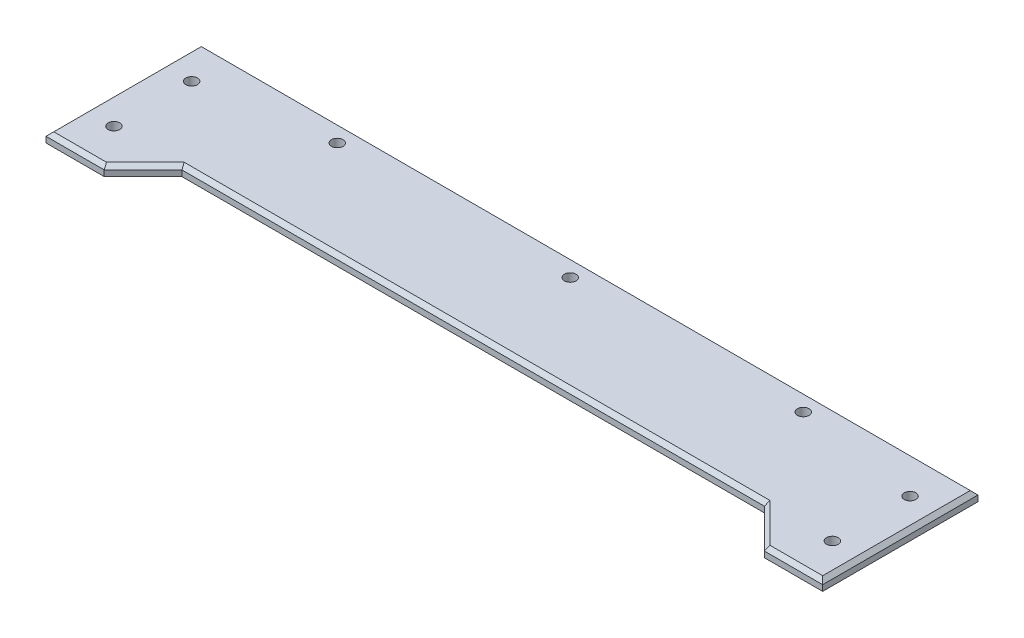
ISO-10303-21;
HEADER;
FILE_DESCRIPTION(('STEP AP214'),'2;1');
FILE_NAME('part.step','',(''),(''),'','','');
FILE_SCHEMA(('AUTOMOTIVE_DESIGN { 1 0 10303 214 1 1 1 1 }'));
ENDSEC;
DATA;
#1=APPLICATION_CONTEXT('core data for automotive mechanical design processes');
#2=APPLICATION_PROTOCOL_DEFINITION('international standard','automotive_design',2000,#1);
#3=PRODUCT_CONTEXT('',#1,'mechanical');
#4=PRODUCT('Part','Part','',(#3));
#5=PRODUCT_RELATED_PRODUCT_CATEGORY('part','',(#4));
#6=PRODUCT_DEFINITION_FORMATION('','',#4);
#7=PRODUCT_DEFINITION_CONTEXT('part definition',#1,'design');
#8=PRODUCT_DEFINITION('design','',#6,#7);
#9=PRODUCT_DEFINITION_SHAPE('','',#8);
#10=(LENGTH_UNIT() NAMED_UNIT(*) SI_UNIT(.MILLI.,.METRE.));
#11=(NAMED_UNIT(*) PLANE_ANGLE_UNIT() SI_UNIT($,.RADIAN.));
#12=(NAMED_UNIT(*) SI_UNIT($,.STERADIAN.) SOLID_ANGLE_UNIT());
#13=UNCERTAINTY_MEASURE_WITH_UNIT(LENGTH_MEASURE(1.E-05),#10,'distance_accuracy_value','');
#14=(GEOMETRIC_REPRESENTATION_CONTEXT(3) GLOBAL_UNCERTAINTY_ASSIGNED_CONTEXT((#13)) GLOBAL_UNIT_ASSIGNED_CONTEXT((#10,
#11,#12)) REPRESENTATION_CONTEXT('',''));
#15=CARTESIAN_POINT('',(0.,0.,0.));
#16=DIRECTION('',(0.,0.,1.));
#17=DIRECTION('',(1.,0.,0.));
#18=AXIS2_PLACEMENT_3D('',#15,#16,#17);
#19=CARTESIAN_POINT('',(0.,5.,0.));
#20=DIRECTION('',(0.,1.,0.));
#21=DIRECTION('',(0.,0.,1.));
#22=AXIS2_PLACEMENT_3D('',#19,#20,#21);
#23=PLANE('',#22);
#24=DIRECTION('',(1.,0.,0.));
#25=VECTOR('',#24,1.);
#26=CARTESIAN_POINT('',(170.392156862745,5.,17.6078431372549));
#27=LINE('',#26,#25);
#28=CARTESIAN_POINT('',(-130.436270262001,5.,17.6078431372549));
#29=VERTEX_POINT('',#28);
#30=CARTESIAN_POINT('',(171.220583987491,5.,17.6078431372549));
#31=VERTEX_POINT('',#30);
#32=EDGE_CURVE('E185',#29,#31,#27,.T.);
#33=ORIENTED_EDGE('',*,*,#32,.T.);
#34=DIRECTION('',(0.707106781186546,0.,0.707106781186549));
#35=VECTOR('',#34,1.);
#36=CARTESIAN_POINT('',(191.806370425118,5.,38.1936295748818));
#37=LINE('',#36,#35);
#38=CARTESIAN_POINT('',(191.220583987491,5.,37.6078431372549));
#39=VERTEX_POINT('',#38);
#40=EDGE_CURVE('E189',#31,#39,#37,.T.);
#41=ORIENTED_EDGE('',*,*,#40,.T.);
#42=DIRECTION('',(1.,0.,0.));
#43=VECTOR('',#42,1.);
#44=CARTESIAN_POINT('',(220.392156862745,5.,37.6078431372549));
#45=LINE('',#44,#43);
#46=CARTESIAN_POINT('',(218.392156862745,5.,37.6078431372549));
#47=VERTEX_POINT('',#46);
#48=EDGE_CURVE('E187',#39,#47,#45,.T.);
#49=ORIENTED_EDGE('',*,*,#48,.T.);
#50=DIRECTION('',(0.,0.,-1.));
#51=VECTOR('',#50,1.);
#52=CARTESIAN_POINT('',(218.392156862745,5.,-40.3921568627451));
#53=LINE('',#52,#51);
#54=CARTESIAN_POINT('',(218.392156862745,5.,-38.3921568627451));
#55=VERTEX_POINT('',#54);
#56=EDGE_CURVE('E181',#47,#55,#53,.T.);
#57=ORIENTED_EDGE('',*,*,#56,.T.);
#58=DIRECTION('',(-1.,0.,0.));
#59=VECTOR('',#58,1.);
#60=CARTESIAN_POINT('',(-179.607843137255,5.,-38.3921568627451));
#61=LINE('',#60,#59);
#62=CARTESIAN_POINT('',(-177.607843137255,5.,-38.3921568627451));
#63=VERTEX_POINT('',#62);
#64=EDGE_CURVE('E179',#55,#63,#61,.T.);
#65=ORIENTED_EDGE('',*,*,#64,.T.);
#66=DIRECTION('',(0.,0.,1.));
#67=VECTOR('',#66,1.);
#68=CARTESIAN_POINT('',(-177.607843137255,5.,39.6078431372549));
#69=LINE('',#68,#67);
#70=CARTESIAN_POINT('',(-177.607843137255,5.,37.6078431372549));
#71=VERTEX_POINT('',#70);
#72=EDGE_CURVE('E177',#63,#71,#69,.T.);
#73=ORIENTED_EDGE('',*,*,#72,.T.);
#74=DIRECTION('',(1.,0.,0.));
#75=VECTOR('',#74,1.);
#76=CARTESIAN_POINT('',(-149.607843137255,5.,37.6078431372549));
#77=LINE('',#76,#75);
#78=CARTESIAN_POINT('',(-150.436270262001,5.,37.6078431372549));
#79=VERTEX_POINT('',#78);
#80=EDGE_CURVE('E126',#71,#79,#77,.T.);
#81=ORIENTED_EDGE('',*,*,#80,.T.);
#82=DIRECTION('',(0.707106781186546,0.,-0.707106781186549));
#83=VECTOR('',#82,1.);
#84=CARTESIAN_POINT('',(-131.022056699628,5.,18.1936295748818));
#85=LINE('',#84,#83);
#86=EDGE_CURVE('E183',#79,#29,#85,.T.);
#87=ORIENTED_EDGE('',*,*,#86,.T.);
#88=EDGE_LOOP('',(#33,#41,#49,#57,#65,#73,#81,#87));
#89=FACE_BOUND('',#88,.T.);
#90=CARTESIAN_POINT('',(205.392156862745,5.,-20.3921568627451));
#91=DIRECTION('',(0.,1.,0.));
#92=DIRECTION('',(0.,0.,1.));
#93=AXIS2_PLACEMENT_3D('',#90,#91,#92);
#94=CIRCLE('',#93,2.99999999999999);
#95=CARTESIAN_POINT('',(205.392156862745,5.,-17.3921568627451));
#96=VERTEX_POINT('',#95);
#97=EDGE_CURVE('E241',#96,#96,#94,.T.);
#98=ORIENTED_EDGE('',*,*,#97,.F.);
#99=EDGE_LOOP('',(#98));
#100=FACE_BOUND('',#99,.T.);
#101=CARTESIAN_POINT('',(20.392156862745,5.,-30.3921568627451));
#102=DIRECTION('',(0.,1.,0.));
#103=DIRECTION('',(0.,0.,1.));
#104=AXIS2_PLACEMENT_3D('',#101,#102,#103);
#105=CIRCLE('',#104,3.);
#106=CARTESIAN_POINT('',(20.392156862745,5.,-27.3921568627451));
#107=VERTEX_POINT('',#106);
#108=EDGE_CURVE('E253',#107,#107,#105,.T.);
#109=ORIENTED_EDGE('',*,*,#108,.F.);
#110=EDGE_LOOP('',(#109));
#111=FACE_BOUND('',#110,.T.);
#112=CARTESIAN_POINT('',(-99.607843137255,5.,-30.3921568627451));
#113=DIRECTION('',(0.,1.,0.));
#114=DIRECTION('',(0.,0.,1.));
#115=AXIS2_PLACEMENT_3D('',#112,#113,#114);
#116=CIRCLE('',#115,3.00000000000001);
#117=CARTESIAN_POINT('',(-99.607843137255,5.,-27.3921568627451));
#118=VERTEX_POINT('',#117);
#119=EDGE_CURVE('E265',#118,#118,#116,.T.);
#120=ORIENTED_EDGE('',*,*,#119,.F.);
#121=EDGE_LOOP('',(#120));
#122=FACE_BOUND('',#121,.T.);
#123=CARTESIAN_POINT('',(-164.607843137255,5.,-20.3921568627451));
#124=DIRECTION('',(0.,1.,0.));
#125=DIRECTION('',(0.,0.,1.));
#126=AXIS2_PLACEMENT_3D('',#123,#124,#125);
#127=CIRCLE('',#126,2.99999999999999);
#128=CARTESIAN_POINT('',(-164.607843137255,5.,-17.3921568627451));
#129=VERTEX_POINT('',#128);
#130=EDGE_CURVE('E142',#129,#129,#127,.T.);
#131=ORIENTED_EDGE('',*,*,#130,.F.);
#132=EDGE_LOOP('',(#131));
#133=FACE_BOUND('',#132,.T.);
#134=CARTESIAN_POINT('',(140.392156862745,5.,-30.3921568627451));
#135=DIRECTION('',(0.,1.,0.));
#136=DIRECTION('',(0.,0.,1.));
#137=AXIS2_PLACEMENT_3D('',#134,#135,#136);
#138=CIRCLE('',#137,2.99999999999999);
#139=CARTESIAN_POINT('',(140.392156862745,5.,-27.3921568627451));
#140=VERTEX_POINT('',#139);
#141=EDGE_CURVE('E259',#140,#140,#138,.T.);
#142=ORIENTED_EDGE('',*,*,#141,.F.);
#143=EDGE_LOOP('',(#142));
#144=FACE_BOUND('',#143,.T.);
#145=CARTESIAN_POINT('',(-164.607843137255,5.,19.6078431372549));
#146=DIRECTION('',(0.,1.,0.));
#147=DIRECTION('',(0.,0.,1.));
#148=AXIS2_PLACEMENT_3D('',#145,#146,#147);
#149=CIRCLE('',#148,2.99999999999999);
#150=CARTESIAN_POINT('',(-164.607843137255,5.,22.6078431372549));
#151=VERTEX_POINT('',#150);
#152=EDGE_CURVE('E247',#151,#151,#149,.T.);
#153=ORIENTED_EDGE('',*,*,#152,.F.);
#154=EDGE_LOOP('',(#153));
#155=FACE_BOUND('',#154,.T.);
#156=CARTESIAN_POINT('',(205.392156862745,5.,19.6078431372549));
#157=DIRECTION('',(0.,1.,0.));
#158=DIRECTION('',(0.,0.,1.));
#159=AXIS2_PLACEMENT_3D('',#156,#157,#158);
#160=CIRCLE('',#159,2.99999999999999);
#161=CARTESIAN_POINT('',(205.392156862745,5.,22.6078431372549));
#162=VERTEX_POINT('',#161);
#163=EDGE_CURVE('E233',#162,#162,#160,.T.);
#164=ORIENTED_EDGE('',*,*,#163,.F.);
#165=EDGE_LOOP('',(#164));
#166=FACE_BOUND('',#165,.T.);
#167=ADVANCED_FACE('F33',(#89,#100,#111,#122,#133,#144,#155,#166),#23,.T.);
#168=CARTESIAN_POINT('',(0.,0.,0.));
#169=DIRECTION('',(0.,1.,0.));
#170=DIRECTION('',(0.,0.,1.));
#171=AXIS2_PLACEMENT_3D('',#168,#169,#170);
#172=PLANE('',#171);
#173=CARTESIAN_POINT('',(205.392156862745,0.,-20.3921568627451));
#174=DIRECTION('',(0.,1.,0.));
#175=DIRECTION('',(0.,0.,1.));
#176=AXIS2_PLACEMENT_3D('',#173,#174,#175);
#177=CIRCLE('',#176,2.99999999999999);
#178=CARTESIAN_POINT('',(205.392156862745,0.,-17.3921568627451));
#179=VERTEX_POINT('',#178);
#180=EDGE_CURVE('E238',#179,#179,#177,.T.);
#181=ORIENTED_EDGE('',*,*,#180,.T.);
#182=EDGE_LOOP('',(#181));
#183=FACE_BOUND('',#182,.T.);
#184=CARTESIAN_POINT('',(20.392156862745,0.,-30.3921568627451));
#185=DIRECTION('',(0.,1.,0.));
#186=DIRECTION('',(0.,0.,1.));
#187=AXIS2_PLACEMENT_3D('',#184,#185,#186);
#188=CIRCLE('',#187,3.);
#189=CARTESIAN_POINT('',(20.392156862745,0.,-27.3921568627451));
#190=VERTEX_POINT('',#189);
#191=EDGE_CURVE('E250',#190,#190,#188,.T.);
#192=ORIENTED_EDGE('',*,*,#191,.T.);
#193=EDGE_LOOP('',(#192));
#194=FACE_BOUND('',#193,.T.);
#195=CARTESIAN_POINT('',(-99.607843137255,0.,-30.3921568627451));
#196=DIRECTION('',(0.,1.,0.));
#197=DIRECTION('',(0.,0.,1.));
#198=AXIS2_PLACEMENT_3D('',#195,#196,#197);
#199=CIRCLE('',#198,3.00000000000001);
#200=CARTESIAN_POINT('',(-99.607843137255,0.,-27.3921568627451));
#201=VERTEX_POINT('',#200);
#202=EDGE_CURVE('E262',#201,#201,#199,.T.);
#203=ORIENTED_EDGE('',*,*,#202,.T.);
#204=EDGE_LOOP('',(#203));
#205=FACE_BOUND('',#204,.T.);
#206=DIRECTION('',(0.,0.,1.));
#207=VECTOR('',#206,1.);
#208=CARTESIAN_POINT('',(-179.607843137255,0.,-40.3921568627451));
#209=LINE('',#208,#207);
#210=CARTESIAN_POINT('',(-179.607843137255,0.,-40.3921568627451));
#211=VERTEX_POINT('',#210);
#212=CARTESIAN_POINT('',(-179.607843137255,0.,39.6078431372549));
#213=VERTEX_POINT('',#212);
#214=EDGE_CURVE('E134',#211,#213,#209,.T.);
#215=ORIENTED_EDGE('',*,*,#214,.F.);
#216=DIRECTION('',(-1.,0.,0.));
#217=VECTOR('',#216,1.);
#218=CARTESIAN_POINT('',(-179.607843137255,0.,-40.3921568627451));
#219=LINE('',#218,#217);
#220=CARTESIAN_POINT('',(220.392156862745,0.,-40.3921568627451));
#221=VERTEX_POINT('',#220);
#222=EDGE_CURVE('E162',#221,#211,#219,.T.);
#223=ORIENTED_EDGE('',*,*,#222,.F.);
#224=DIRECTION('',(0.,0.,-1.));
#225=VECTOR('',#224,1.);
#226=CARTESIAN_POINT('',(220.392156862745,0.,-40.3921568627451));
#227=LINE('',#226,#225);
#228=CARTESIAN_POINT('',(220.392156862745,0.,39.6078431372549));
#229=VERTEX_POINT('',#228);
#230=EDGE_CURVE('E159',#229,#221,#227,.T.);
#231=ORIENTED_EDGE('',*,*,#230,.F.);
#232=DIRECTION('',(1.,0.,0.));
#233=VECTOR('',#232,1.);
#234=CARTESIAN_POINT('',(190.392156862745,0.,39.6078431372549));
#235=LINE('',#234,#233);
#236=CARTESIAN_POINT('',(190.392156862745,0.,39.6078431372549));
#237=VERTEX_POINT('',#236);
#238=EDGE_CURVE('E156',#237,#229,#235,.T.);
#239=ORIENTED_EDGE('',*,*,#238,.F.);
#240=DIRECTION('',(0.707106781186546,0.,0.707106781186549));
#241=VECTOR('',#240,1.);
#242=CARTESIAN_POINT('',(170.392156862745,0.,19.6078431372549));
#243=LINE('',#242,#241);
#244=CARTESIAN_POINT('',(170.392156862745,0.,19.6078431372549));
#245=VERTEX_POINT('',#244);
#246=EDGE_CURVE('E153',#245,#237,#243,.T.);
#247=ORIENTED_EDGE('',*,*,#246,.F.);
#248=DIRECTION('',(1.,0.,0.));
#249=VECTOR('',#248,1.);
#250=CARTESIAN_POINT('',(-129.607843137255,0.,19.6078431372549));
#251=LINE('',#250,#249);
#252=CARTESIAN_POINT('',(-129.607843137255,0.,19.6078431372549));
#253=VERTEX_POINT('',#252);
#254=EDGE_CURVE('E150',#253,#245,#251,.T.);
#255=ORIENTED_EDGE('',*,*,#254,.F.);
#256=DIRECTION('',(0.707106781186546,0.,-0.707106781186549));
#257=VECTOR('',#256,1.);
#258=CARTESIAN_POINT('',(-149.607843137255,0.,39.6078431372549));
#259=LINE('',#258,#257);
#260=CARTESIAN_POINT('',(-149.607843137255,0.,39.6078431372549));
#261=VERTEX_POINT('',#260);
#262=EDGE_CURVE('E137',#261,#253,#259,.T.);
#263=ORIENTED_EDGE('',*,*,#262,.F.);
#264=DIRECTION('',(1.,0.,0.));
#265=VECTOR('',#264,1.);
#266=CARTESIAN_POINT('',(-179.607843137255,0.,39.6078431372549));
#267=LINE('',#266,#265);
#268=EDGE_CURVE('E123',#213,#261,#267,.T.);
#269=ORIENTED_EDGE('',*,*,#268,.F.);
#270=EDGE_LOOP('',(#215,#223,#231,#239,#247,#255,#263,#269));
#271=FACE_BOUND('',#270,.T.);
#272=CARTESIAN_POINT('',(-164.607843137255,0.,-20.3921568627451));
#273=DIRECTION('',(0.,1.,0.));
#274=DIRECTION('',(0.,0.,1.));
#275=AXIS2_PLACEMENT_3D('',#272,#273,#274);
#276=CIRCLE('',#275,2.99999999999999);
#277=CARTESIAN_POINT('',(-164.607843137255,0.,-17.3921568627451));
#278=VERTEX_POINT('',#277);
#279=EDGE_CURVE('E145',#278,#278,#276,.T.);
#280=ORIENTED_EDGE('',*,*,#279,.T.);
#281=EDGE_LOOP('',(#280));
#282=FACE_BOUND('',#281,.T.);
#283=CARTESIAN_POINT('',(140.392156862745,0.,-30.3921568627451));
#284=DIRECTION('',(0.,1.,0.));
#285=DIRECTION('',(0.,0.,1.));
#286=AXIS2_PLACEMENT_3D('',#283,#284,#285);
#287=CIRCLE('',#286,2.99999999999999);
#288=CARTESIAN_POINT('',(140.392156862745,0.,-27.3921568627451));
#289=VERTEX_POINT('',#288);
#290=EDGE_CURVE('E256',#289,#289,#287,.T.);
#291=ORIENTED_EDGE('',*,*,#290,.T.);
#292=EDGE_LOOP('',(#291));
#293=FACE_BOUND('',#292,.T.);
#294=CARTESIAN_POINT('',(-164.607843137255,0.,19.6078431372549));
#295=DIRECTION('',(0.,1.,0.));
#296=DIRECTION('',(0.,0.,1.));
#297=AXIS2_PLACEMENT_3D('',#294,#295,#296);
#298=CIRCLE('',#297,2.99999999999999);
#299=CARTESIAN_POINT('',(-164.607843137255,0.,22.6078431372549));
#300=VERTEX_POINT('',#299);
#301=EDGE_CURVE('E244',#300,#300,#298,.T.);
#302=ORIENTED_EDGE('',*,*,#301,.T.);
#303=EDGE_LOOP('',(#302));
#304=FACE_BOUND('',#303,.T.);
#305=CARTESIAN_POINT('',(205.392156862745,0.,19.6078431372549));
#306=DIRECTION('',(0.,1.,0.));
#307=DIRECTION('',(0.,0.,1.));
#308=AXIS2_PLACEMENT_3D('',#305,#306,#307);
#309=CIRCLE('',#308,2.99999999999999);
#310=CARTESIAN_POINT('',(205.392156862745,0.,22.6078431372549));
#311=VERTEX_POINT('',#310);
#312=EDGE_CURVE('E228',#311,#311,#309,.T.);
#313=ORIENTED_EDGE('',*,*,#312,.T.);
#314=EDGE_LOOP('',(#313));
#315=FACE_BOUND('',#314,.T.);
#316=ADVANCED_FACE('F131',(#183,#194,#205,#271,#282,#293,#304,#315),#172,.F.);
#317=CARTESIAN_POINT('',(-179.607843137255,5.,-40.3921568627451));
#318=DIRECTION('',(1.,0.,0.));
#319=DIRECTION('',(0.,0.,-1.));
#320=AXIS2_PLACEMENT_3D('',#317,#318,#319);
#321=PLANE('',#320);
#322=DIRECTION('',(0.,-1.,0.));
#323=VECTOR('',#322,1.);
#324=CARTESIAN_POINT('',(-179.607843137255,5.,39.6078431372549));
#325=LINE('',#324,#323);
#326=CARTESIAN_POINT('',(-179.607843137255,3.,39.6078431372549));
#327=VERTEX_POINT('',#326);
#328=EDGE_CURVE('E120',#327,#213,#325,.T.);
#329=ORIENTED_EDGE('',*,*,#328,.F.);
#330=DIRECTION('',(0.,0.,-1.));
#331=VECTOR('',#330,1.);
#332=CARTESIAN_POINT('',(-179.607843137255,3.,-40.3921568627451));
#333=LINE('',#332,#331);
#334=CARTESIAN_POINT('',(-179.607843137255,3.,-40.3921568627451));
#335=VERTEX_POINT('',#334);
#336=EDGE_CURVE('E42',#327,#335,#333,.T.);
#337=ORIENTED_EDGE('',*,*,#336,.T.);
#338=DIRECTION('',(0.,-1.,0.));
#339=VECTOR('',#338,1.);
#340=CARTESIAN_POINT('',(-179.607843137255,5.,-40.3921568627451));
#341=LINE('',#340,#339);
#342=EDGE_CURVE('E140',#335,#211,#341,.T.);
#343=ORIENTED_EDGE('',*,*,#342,.T.);
#344=ORIENTED_EDGE('',*,*,#214,.T.);
#345=EDGE_LOOP('',(#329,#337,#343,#344));
#346=FACE_BOUND('',#345,.T.);
#347=ADVANCED_FACE('F139',(#346),#321,.F.);
#348=CARTESIAN_POINT('',(-179.607843137255,5.,39.6078431372549));
#349=DIRECTION('',(0.,0.,-1.));
#350=DIRECTION('',(-1.,0.,0.));
#351=AXIS2_PLACEMENT_3D('',#348,#349,#350);
#352=PLANE('',#351);
#353=DIRECTION('',(0.,-1.,0.));
#354=VECTOR('',#353,1.);
#355=CARTESIAN_POINT('',(-149.607843137255,5.,39.6078431372549));
#356=LINE('',#355,#354);
#357=CARTESIAN_POINT('',(-149.607843137255,3.,39.6078431372549));
#358=VERTEX_POINT('',#357);
#359=EDGE_CURVE('E127',#358,#261,#356,.T.);
#360=ORIENTED_EDGE('',*,*,#359,.F.);
#361=DIRECTION('',(-1.,0.,0.));
#362=VECTOR('',#361,1.);
#363=CARTESIAN_POINT('',(-179.607843137255,3.,39.6078431372549));
#364=LINE('',#363,#362);
#365=EDGE_CURVE('E11',#358,#327,#364,.T.);
#366=ORIENTED_EDGE('',*,*,#365,.T.);
#367=ORIENTED_EDGE('',*,*,#328,.T.);
#368=ORIENTED_EDGE('',*,*,#268,.T.);
#369=EDGE_LOOP('',(#360,#366,#367,#368));
#370=FACE_BOUND('',#369,.T.);
#371=ADVANCED_FACE('F122',(#370),#352,.F.);
#372=CARTESIAN_POINT('',(-149.607843137255,5.,39.6078431372549));
#373=DIRECTION('',(-0.707106781186549,0.,-0.707106781186546));
#374=DIRECTION('',(-0.707106781186546,0.,0.707106781186549));
#375=AXIS2_PLACEMENT_3D('',#372,#373,#374);
#376=PLANE('',#375);
#377=DIRECTION('',(0.,-1.,0.));
#378=VECTOR('',#377,1.);
#379=CARTESIAN_POINT('',(-129.607843137255,5.,19.6078431372549));
#380=LINE('',#379,#378);
#381=CARTESIAN_POINT('',(-129.607843137255,2.99999999999999,19.6078431372549));
#382=VERTEX_POINT('',#381);
#383=EDGE_CURVE('E173',#382,#253,#380,.T.);
#384=ORIENTED_EDGE('',*,*,#383,.F.);
#385=DIRECTION('',(-0.707106781186546,0.,0.707106781186549));
#386=VECTOR('',#385,1.);
#387=CARTESIAN_POINT('',(-149.607843137255,2.99999999999999,39.6078431372549));
#388=LINE('',#387,#386);
#389=EDGE_CURVE('E199',#382,#358,#388,.T.);
#390=ORIENTED_EDGE('',*,*,#389,.T.);
#391=ORIENTED_EDGE('',*,*,#359,.T.);
#392=ORIENTED_EDGE('',*,*,#262,.T.);
#393=EDGE_LOOP('',(#384,#390,#391,#392));
#394=FACE_BOUND('',#393,.T.);
#395=ADVANCED_FACE('F316',(#394),#376,.F.);
#396=CARTESIAN_POINT('',(-129.607843137255,5.,19.6078431372549));
#397=DIRECTION('',(0.,0.,-1.));
#398=DIRECTION('',(-1.,0.,0.));
#399=AXIS2_PLACEMENT_3D('',#396,#397,#398);
#400=PLANE('',#399);
#401=DIRECTION('',(0.,-1.,0.));
#402=VECTOR('',#401,1.);
#403=CARTESIAN_POINT('',(170.392156862745,5.,19.6078431372549));
#404=LINE('',#403,#402);
#405=CARTESIAN_POINT('',(170.392156862745,3.,19.6078431372549));
#406=VERTEX_POINT('',#405);
#407=EDGE_CURVE('E171',#406,#245,#404,.T.);
#408=ORIENTED_EDGE('',*,*,#407,.F.);
#409=DIRECTION('',(-1.,0.,0.));
#410=VECTOR('',#409,1.);
#411=CARTESIAN_POINT('',(-129.607843137255,3.,19.6078431372549));
#412=LINE('',#411,#410);
#413=EDGE_CURVE('E197',#406,#382,#412,.T.);
#414=ORIENTED_EDGE('',*,*,#413,.T.);
#415=ORIENTED_EDGE('',*,*,#383,.T.);
#416=ORIENTED_EDGE('',*,*,#254,.T.);
#417=EDGE_LOOP('',(#408,#414,#415,#416));
#418=FACE_BOUND('',#417,.T.);
#419=ADVANCED_FACE('F312',(#418),#400,.F.);
#420=CARTESIAN_POINT('',(170.392156862745,5.,19.6078431372549));
#421=DIRECTION('',(0.707106781186549,0.,-0.707106781186546));
#422=DIRECTION('',(-0.707106781186546,0.,-0.707106781186549));
#423=AXIS2_PLACEMENT_3D('',#420,#421,#422);
#424=PLANE('',#423);
#425=DIRECTION('',(0.,-1.,0.));
#426=VECTOR('',#425,1.);
#427=CARTESIAN_POINT('',(190.392156862745,5.,39.6078431372549));
#428=LINE('',#427,#426);
#429=CARTESIAN_POINT('',(190.392156862745,3.,39.6078431372549));
#430=VERTEX_POINT('',#429);
#431=EDGE_CURVE('E169',#430,#237,#428,.T.);
#432=ORIENTED_EDGE('',*,*,#431,.F.);
#433=DIRECTION('',(-0.707106781186546,0.,-0.707106781186549));
#434=VECTOR('',#433,1.);
#435=CARTESIAN_POINT('',(170.392156862745,2.99999999999999,19.6078431372549));
#436=LINE('',#435,#434);
#437=EDGE_CURVE('E192',#430,#406,#436,.T.);
#438=ORIENTED_EDGE('',*,*,#437,.T.);
#439=ORIENTED_EDGE('',*,*,#407,.T.);
#440=ORIENTED_EDGE('',*,*,#246,.T.);
#441=EDGE_LOOP('',(#432,#438,#439,#440));
#442=FACE_BOUND('',#441,.T.);
#443=ADVANCED_FACE('F308',(#442),#424,.F.);
#444=CARTESIAN_POINT('',(190.392156862745,5.,39.6078431372549));
#445=DIRECTION('',(0.,0.,-1.));
#446=DIRECTION('',(-1.,0.,0.));
#447=AXIS2_PLACEMENT_3D('',#444,#445,#446);
#448=PLANE('',#447);
#449=DIRECTION('',(0.,-1.,0.));
#450=VECTOR('',#449,1.);
#451=CARTESIAN_POINT('',(220.392156862745,5.,39.6078431372549));
#452=LINE('',#451,#450);
#453=CARTESIAN_POINT('',(220.392156862745,3.,39.6078431372549));
#454=VERTEX_POINT('',#453);
#455=EDGE_CURVE('E167',#454,#229,#452,.T.);
#456=ORIENTED_EDGE('',*,*,#455,.F.);
#457=DIRECTION('',(-1.,0.,0.));
#458=VECTOR('',#457,1.);
#459=CARTESIAN_POINT('',(190.392156862745,3.,39.6078431372549));
#460=LINE('',#459,#458);
#461=EDGE_CURVE('E195',#454,#430,#460,.T.);
#462=ORIENTED_EDGE('',*,*,#461,.T.);
#463=ORIENTED_EDGE('',*,*,#431,.T.);
#464=ORIENTED_EDGE('',*,*,#238,.T.);
#465=EDGE_LOOP('',(#456,#462,#463,#464));
#466=FACE_BOUND('',#465,.T.);
#467=ADVANCED_FACE('F304',(#466),#448,.F.);
#468=CARTESIAN_POINT('',(220.392156862745,5.,-40.3921568627451));
#469=DIRECTION('',(-1.,0.,0.));
#470=DIRECTION('',(0.,0.,1.));
#471=AXIS2_PLACEMENT_3D('',#468,#469,#470);
#472=PLANE('',#471);
#473=DIRECTION('',(0.,-1.,0.));
#474=VECTOR('',#473,1.);
#475=CARTESIAN_POINT('',(220.392156862745,5.,-40.3921568627451));
#476=LINE('',#475,#474);
#477=CARTESIAN_POINT('',(220.392156862745,3.,-40.3921568627451));
#478=VERTEX_POINT('',#477);
#479=EDGE_CURVE('E165',#478,#221,#476,.T.);
#480=ORIENTED_EDGE('',*,*,#479,.F.);
#481=DIRECTION('',(0.,0.,1.));
#482=VECTOR('',#481,1.);
#483=CARTESIAN_POINT('',(220.392156862745,3.,39.6078431372549));
#484=LINE('',#483,#482);
#485=EDGE_CURVE('E201',#478,#454,#484,.T.);
#486=ORIENTED_EDGE('',*,*,#485,.T.);
#487=ORIENTED_EDGE('',*,*,#455,.T.);
#488=ORIENTED_EDGE('',*,*,#230,.T.);
#489=EDGE_LOOP('',(#480,#486,#487,#488));
#490=FACE_BOUND('',#489,.T.);
#491=ADVANCED_FACE('F300',(#490),#472,.F.);
#492=CARTESIAN_POINT('',(-179.607843137255,5.,-40.3921568627451));
#493=DIRECTION('',(0.,0.,1.));
#494=DIRECTION('',(1.,0.,0.));
#495=AXIS2_PLACEMENT_3D('',#492,#493,#494);
#496=PLANE('',#495);
#497=ORIENTED_EDGE('',*,*,#342,.F.);
#498=DIRECTION('',(1.,0.,0.));
#499=VECTOR('',#498,1.);
#500=CARTESIAN_POINT('',(220.392156862745,3.,-40.3921568627451));
#501=LINE('',#500,#499);
#502=EDGE_CURVE('E203',#335,#478,#501,.T.);
#503=ORIENTED_EDGE('',*,*,#502,.T.);
#504=ORIENTED_EDGE('',*,*,#479,.T.);
#505=ORIENTED_EDGE('',*,*,#222,.T.);
#506=EDGE_LOOP('',(#497,#503,#504,#505));
#507=FACE_BOUND('',#506,.T.);
#508=ADVANCED_FACE('F285',(#507),#496,.F.);
#509=CARTESIAN_POINT('',(-164.607843137255,5.,-20.3921568627451));
#510=DIRECTION('',(0.,-1.,0.));
#511=DIRECTION('',(0.,0.,-1.));
#512=AXIS2_PLACEMENT_3D('',#509,#510,#511);
#513=CYLINDRICAL_SURFACE('',#512,2.99999999999999);
#514=ORIENTED_EDGE('',*,*,#130,.T.);
#515=EDGE_LOOP('',(#514));
#516=FACE_BOUND('',#515,.T.);
#517=ORIENTED_EDGE('',*,*,#279,.F.);
#518=EDGE_LOOP('',(#517));
#519=FACE_BOUND('',#518,.T.);
#520=ADVANCED_FACE('F275',(#516,#519),#513,.F.);
#521=CARTESIAN_POINT('',(-99.607843137255,5.,-30.3921568627451));
#522=DIRECTION('',(0.,-1.,0.));
#523=DIRECTION('',(0.,0.,-1.));
#524=AXIS2_PLACEMENT_3D('',#521,#522,#523);
#525=CYLINDRICAL_SURFACE('',#524,3.00000000000001);
#526=ORIENTED_EDGE('',*,*,#119,.T.);
#527=EDGE_LOOP('',(#526));
#528=FACE_BOUND('',#527,.T.);
#529=ORIENTED_EDGE('',*,*,#202,.F.);
#530=EDGE_LOOP('',(#529));
#531=FACE_BOUND('',#530,.T.);
#532=ADVANCED_FACE('F272',(#528,#531),#525,.F.);
#533=CARTESIAN_POINT('',(140.392156862745,5.,-30.3921568627451));
#534=DIRECTION('',(0.,-1.,0.));
#535=DIRECTION('',(0.,0.,-1.));
#536=AXIS2_PLACEMENT_3D('',#533,#534,#535);
#537=CYLINDRICAL_SURFACE('',#536,2.99999999999999);
#538=ORIENTED_EDGE('',*,*,#141,.T.);
#539=EDGE_LOOP('',(#538));
#540=FACE_BOUND('',#539,.T.);
#541=ORIENTED_EDGE('',*,*,#290,.F.);
#542=EDGE_LOOP('',(#541));
#543=FACE_BOUND('',#542,.T.);
#544=ADVANCED_FACE('F274',(#540,#543),#537,.F.);
#545=CARTESIAN_POINT('',(20.392156862745,5.,-30.3921568627451));
#546=DIRECTION('',(0.,-1.,0.));
#547=DIRECTION('',(0.,0.,-1.));
#548=AXIS2_PLACEMENT_3D('',#545,#546,#547);
#549=CYLINDRICAL_SURFACE('',#548,3.);
#550=ORIENTED_EDGE('',*,*,#108,.T.);
#551=EDGE_LOOP('',(#550));
#552=FACE_BOUND('',#551,.T.);
#553=ORIENTED_EDGE('',*,*,#191,.F.);
#554=EDGE_LOOP('',(#553));
#555=FACE_BOUND('',#554,.T.);
#556=ADVANCED_FACE('F282',(#552,#555),#549,.F.);
#557=CARTESIAN_POINT('',(-164.607843137255,5.,19.6078431372549));
#558=DIRECTION('',(0.,-1.,0.));
#559=DIRECTION('',(0.,0.,-1.));
#560=AXIS2_PLACEMENT_3D('',#557,#558,#559);
#561=CYLINDRICAL_SURFACE('',#560,2.99999999999999);
#562=ORIENTED_EDGE('',*,*,#152,.T.);
#563=EDGE_LOOP('',(#562));
#564=FACE_BOUND('',#563,.T.);
#565=ORIENTED_EDGE('',*,*,#301,.F.);
#566=EDGE_LOOP('',(#565));
#567=FACE_BOUND('',#566,.T.);
#568=ADVANCED_FACE('F388',(#564,#567),#561,.F.);
#569=CARTESIAN_POINT('',(205.392156862745,5.,-20.3921568627451));
#570=DIRECTION('',(0.,-1.,0.));
#571=DIRECTION('',(0.,0.,-1.));
#572=AXIS2_PLACEMENT_3D('',#569,#570,#571);
#573=CYLINDRICAL_SURFACE('',#572,2.99999999999999);
#574=ORIENTED_EDGE('',*,*,#97,.T.);
#575=EDGE_LOOP('',(#574));
#576=FACE_BOUND('',#575,.T.);
#577=ORIENTED_EDGE('',*,*,#180,.F.);
#578=EDGE_LOOP('',(#577));
#579=FACE_BOUND('',#578,.T.);
#580=ADVANCED_FACE('F357',(#576,#579),#573,.F.);
#581=CARTESIAN_POINT('',(205.392156862745,5.,19.6078431372549));
#582=DIRECTION('',(0.,-1.,0.));
#583=DIRECTION('',(0.,0.,-1.));
#584=AXIS2_PLACEMENT_3D('',#581,#582,#583);
#585=CYLINDRICAL_SURFACE('',#584,2.99999999999999);
#586=ORIENTED_EDGE('',*,*,#163,.T.);
#587=EDGE_LOOP('',(#586));
#588=FACE_BOUND('',#587,.T.);
#589=ORIENTED_EDGE('',*,*,#312,.F.);
#590=EDGE_LOOP('',(#589));
#591=FACE_BOUND('',#590,.T.);
#592=ADVANCED_FACE('F352',(#588,#591),#585,.F.);
#593=CARTESIAN_POINT('',(-177.607843137255,5.,0.));
#594=DIRECTION('',(-0.707106781186547,0.707106781186547,0.));
#595=DIRECTION('',(0.,0.,-1.));
#596=AXIS2_PLACEMENT_3D('',#593,#594,#595);
#597=PLANE('',#596);
#598=DIRECTION('',(-0.577350269189626,-0.577350269189626,-0.577350269189625));
#599=VECTOR('',#598,1.);
#600=CARTESIAN_POINT('',(-164.81045751634,17.797385620915,-25.5947712418301));
#601=LINE('',#600,#599);
#602=EDGE_CURVE('E221',#335,#63,#601,.F.);
#603=ORIENTED_EDGE('',*,*,#602,.F.);
#604=ORIENTED_EDGE('',*,*,#336,.F.);
#605=DIRECTION('',(-0.577350269189626,-0.577350269189626,0.577350269189626));
#606=VECTOR('',#605,1.);
#607=CARTESIAN_POINT('',(-118.40522875817,64.202614379085,-21.5947712418301));
#608=LINE('',#607,#606);
#609=EDGE_CURVE('E37',#71,#327,#608,.T.);
#610=ORIENTED_EDGE('',*,*,#609,.F.);
#611=ORIENTED_EDGE('',*,*,#72,.F.);
#612=EDGE_LOOP('',(#603,#604,#610,#611));
#613=FACE_BOUND('',#612,.T.);
#614=ADVANCED_FACE('F35',(#613),#597,.T.);
#615=CARTESIAN_POINT('',(0.,5.,37.6078431372549));
#616=DIRECTION('',(0.,0.707106781186547,0.707106781186547));
#617=DIRECTION('',(-1.,0.,0.));
#618=AXIS2_PLACEMENT_3D('',#615,#616,#617);
#619=PLANE('',#618);
#620=ORIENTED_EDGE('',*,*,#609,.T.);
#621=ORIENTED_EDGE('',*,*,#365,.F.);
#622=DIRECTION('',(-0.281084637714821,0.678598344545847,-0.678598344545847));
#623=VECTOR('',#622,1.);
#624=CARTESIAN_POINT('',(-138.550515137023,-23.694751221767,66.3025943590219));
#625=LINE('',#624,#623);
#626=EDGE_CURVE('E219',#79,#358,#625,.F.);
#627=ORIENTED_EDGE('',*,*,#626,.F.);
#628=ORIENTED_EDGE('',*,*,#80,.F.);
#629=EDGE_LOOP('',(#620,#621,#627,#628));
#630=FACE_BOUND('',#629,.T.);
#631=ADVANCED_FACE('F347',(#630),#619,.T.);
#632=CARTESIAN_POINT('',(0.,5.,-38.3921568627451));
#633=DIRECTION('',(0.,0.707106781186547,-0.707106781186548));
#634=DIRECTION('',(1.,0.,0.));
#635=AXIS2_PLACEMENT_3D('',#632,#633,#634);
#636=PLANE('',#635);
#637=ORIENTED_EDGE('',*,*,#602,.T.);
#638=ORIENTED_EDGE('',*,*,#64,.F.);
#639=DIRECTION('',(0.577350269189626,-0.577350269189626,-0.577350269189625));
#640=VECTOR('',#639,1.);
#641=CARTESIAN_POINT('',(145.59477124183,77.7973856209151,34.4052287581699));
#642=LINE('',#641,#640);
#643=EDGE_CURVE('E216',#478,#55,#642,.F.);
#644=ORIENTED_EDGE('',*,*,#643,.F.);
#645=ORIENTED_EDGE('',*,*,#502,.F.);
#646=EDGE_LOOP('',(#637,#638,#644,#645));
#647=FACE_BOUND('',#646,.T.);
#648=ADVANCED_FACE('F344',(#647),#636,.T.);
#649=CARTESIAN_POINT('',(-56.4142135623734,5.,-56.4142135623732));
#650=DIRECTION('',(0.500000000000001,0.707106781186547,0.499999999999999));
#651=DIRECTION('',(-0.707106781186546,0.,0.707106781186549));
#652=AXIS2_PLACEMENT_3D('',#649,#650,#651);
#653=PLANE('',#652);
#654=ORIENTED_EDGE('',*,*,#626,.T.);
#655=ORIENTED_EDGE('',*,*,#389,.F.);
#656=DIRECTION('',(-0.28108463771482,0.678598344545847,-0.678598344545847));
#657=VECTOR('',#656,1.);
#658=CARTESIAN_POINT('',(-120.130686608209,-19.879879825156,42.4877229624109));
#659=LINE('',#658,#657);
#660=EDGE_CURVE('E213',#29,#382,#659,.F.);
#661=ORIENTED_EDGE('',*,*,#660,.F.);
#662=ORIENTED_EDGE('',*,*,#86,.F.);
#663=EDGE_LOOP('',(#654,#655,#661,#662));
#664=FACE_BOUND('',#663,.T.);
#665=ADVANCED_FACE('F340',(#664),#653,.T.);
#666=CARTESIAN_POINT('',(218.392156862745,5.,0.));
#667=DIRECTION('',(0.707106781186547,0.707106781186547,0.));
#668=DIRECTION('',(0.,0.,1.));
#669=AXIS2_PLACEMENT_3D('',#666,#667,#668);
#670=PLANE('',#669);
#671=ORIENTED_EDGE('',*,*,#643,.T.);
#672=ORIENTED_EDGE('',*,*,#56,.F.);
#673=DIRECTION('',(0.577350269189626,-0.577350269189626,0.577350269189626));
#674=VECTOR('',#673,1.);
#675=CARTESIAN_POINT('',(205.856209150327,17.5359477124183,25.0718954248366));
#676=LINE('',#675,#674);
#677=EDGE_CURVE('E210',#454,#47,#676,.F.);
#678=ORIENTED_EDGE('',*,*,#677,.F.);
#679=ORIENTED_EDGE('',*,*,#485,.F.);
#680=EDGE_LOOP('',(#671,#672,#678,#679));
#681=FACE_BOUND('',#680,.T.);
#682=ADVANCED_FACE('F336',(#681),#670,.T.);
#683=CARTESIAN_POINT('',(0.,5.,17.6078431372549));
#684=DIRECTION('',(0.,0.707106781186548,0.707106781186547));
#685=DIRECTION('',(-1.,0.,0.));
#686=AXIS2_PLACEMENT_3D('',#683,#684,#685);
#687=PLANE('',#686);
#688=ORIENTED_EDGE('',*,*,#660,.T.);
#689=ORIENTED_EDGE('',*,*,#413,.F.);
#690=DIRECTION('',(0.281084637714814,0.678598344545848,-0.678598344545849));
#691=VECTOR('',#690,1.);
#692=CARTESIAN_POINT('',(181.769955787838,30.4684364749148,-7.86059333765993));
#693=LINE('',#692,#691);
#694=EDGE_CURVE('E208',#31,#406,#693,.F.);
#695=ORIENTED_EDGE('',*,*,#694,.F.);
#696=ORIENTED_EDGE('',*,*,#32,.F.);
#697=EDGE_LOOP('',(#688,#689,#695,#696));
#698=FACE_BOUND('',#697,.T.);
#699=ADVANCED_FACE('F332',(#698),#687,.T.);
#700=CARTESIAN_POINT('',(0.,5.,37.6078431372549));
#701=DIRECTION('',(0.,0.707106781186547,0.707106781186547));
#702=DIRECTION('',(-1.,0.,0.));
#703=AXIS2_PLACEMENT_3D('',#700,#701,#702);
#704=PLANE('',#703);
#705=ORIENTED_EDGE('',*,*,#677,.T.);
#706=ORIENTED_EDGE('',*,*,#48,.F.);
#707=DIRECTION('',(-0.281084637714815,-0.678598344545848,0.678598344545848));
#708=VECTOR('',#707,1.);
#709=CARTESIAN_POINT('',(176.112518411469,-31.4740968148552,74.0819399521101));
#710=LINE('',#709,#708);
#711=EDGE_CURVE('E206',#430,#39,#710,.F.);
#712=ORIENTED_EDGE('',*,*,#711,.F.);
#713=ORIENTED_EDGE('',*,*,#461,.F.);
#714=EDGE_LOOP('',(#705,#706,#712,#713));
#715=FACE_BOUND('',#714,.T.);
#716=ADVANCED_FACE('F328',(#715),#704,.T.);
#717=CARTESIAN_POINT('',(76.8063704251186,5.,-76.8063704251183));
#718=DIRECTION('',(-0.500000000000003,0.707106781186545,0.500000000000001));
#719=DIRECTION('',(-0.707106781186546,0.,-0.707106781186549));
#720=AXIS2_PLACEMENT_3D('',#717,#718,#719);
#721=PLANE('',#720);
#722=ORIENTED_EDGE('',*,*,#694,.T.);
#723=ORIENTED_EDGE('',*,*,#437,.F.);
#724=ORIENTED_EDGE('',*,*,#711,.T.);
#725=ORIENTED_EDGE('',*,*,#40,.F.);
#726=EDGE_LOOP('',(#722,#723,#724,#725));
#727=FACE_BOUND('',#726,.T.);
#728=ADVANCED_FACE('F325',(#727),#721,.T.);
#729=CLOSED_SHELL('',(#167,#316,#347,#371,#395,#419,#443,#467,#491,#508,#520,#532,#544,#556,
#568,#580,#592,#614,#631,#648,#665,#682,#699,#716,#728));
#730=MANIFOLD_SOLID_BREP('B2',#729);
#731=ADVANCED_BREP_SHAPE_REPRESENTATION('',(#18,#730),#14);
#732=SHAPE_DEFINITION_REPRESENTATION(#9,#731);
ENDSEC;
END-ISO-10303-21;
